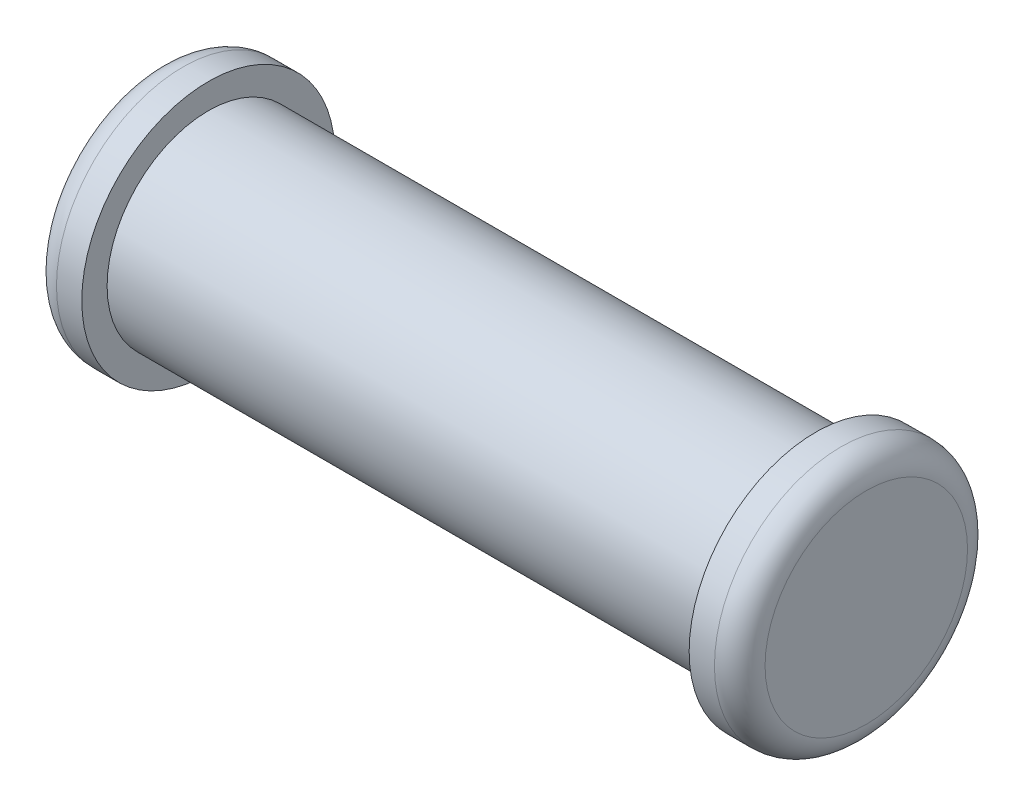
ISO-10303-21;
HEADER;
FILE_DESCRIPTION(('STEP AP214'),'2;1');
FILE_NAME('part.step','',(''),(''),'','','');
FILE_SCHEMA(('AUTOMOTIVE_DESIGN { 1 0 10303 214 1 1 1 1 }'));
ENDSEC;
DATA;
#1=APPLICATION_CONTEXT('core data for automotive mechanical design processes');
#2=APPLICATION_PROTOCOL_DEFINITION('international standard','automotive_design',2000,#1);
#3=PRODUCT_CONTEXT('',#1,'mechanical');
#4=PRODUCT('Part','Part','',(#3));
#5=PRODUCT_RELATED_PRODUCT_CATEGORY('part','',(#4));
#6=PRODUCT_DEFINITION_FORMATION('','',#4);
#7=PRODUCT_DEFINITION_CONTEXT('part definition',#1,'design');
#8=PRODUCT_DEFINITION('design','',#6,#7);
#9=PRODUCT_DEFINITION_SHAPE('','',#8);
#10=(LENGTH_UNIT() NAMED_UNIT(*) SI_UNIT(.MILLI.,.METRE.));
#11=(NAMED_UNIT(*) PLANE_ANGLE_UNIT() SI_UNIT($,.RADIAN.));
#12=(NAMED_UNIT(*) SI_UNIT($,.STERADIAN.) SOLID_ANGLE_UNIT());
#13=UNCERTAINTY_MEASURE_WITH_UNIT(LENGTH_MEASURE(1.E-05),#10,'distance_accuracy_value','');
#14=(GEOMETRIC_REPRESENTATION_CONTEXT(3) GLOBAL_UNCERTAINTY_ASSIGNED_CONTEXT((#13)) GLOBAL_UNIT_ASSIGNED_CONTEXT((#10,
#11,#12)) REPRESENTATION_CONTEXT('',''));
#15=CARTESIAN_POINT('',(0.,0.,0.));
#16=DIRECTION('',(0.,0.,1.));
#17=DIRECTION('',(1.,0.,0.));
#18=AXIS2_PLACEMENT_3D('',#15,#16,#17);
#19=CARTESIAN_POINT('',(12.,0.,0.));
#20=DIRECTION('',(-1.,0.,0.));
#21=DIRECTION('',(0.,0.,1.));
#22=AXIS2_PLACEMENT_3D('',#19,#20,#21);
#23=CYLINDRICAL_SURFACE('',#22,2.);
#24=CARTESIAN_POINT('',(12.,0.,0.));
#25=DIRECTION('',(1.,0.,0.));
#26=DIRECTION('',(0.,0.,-1.));
#27=AXIS2_PLACEMENT_3D('',#24,#25,#26);
#28=CIRCLE('',#27,2.);
#29=CARTESIAN_POINT('',(12.,0.,-2.));
#30=VERTEX_POINT('',#29);
#31=EDGE_CURVE('E69',#30,#30,#28,.T.);
#32=ORIENTED_EDGE('',*,*,#31,.F.);
#33=EDGE_LOOP('',(#32));
#34=FACE_BOUND('',#33,.T.);
#35=CARTESIAN_POINT('',(0.,0.,0.));
#36=DIRECTION('',(1.,0.,0.));
#37=DIRECTION('',(0.,0.,-1.));
#38=AXIS2_PLACEMENT_3D('',#35,#36,#37);
#39=CIRCLE('',#38,2.);
#40=CARTESIAN_POINT('',(0.,0.,-2.));
#41=VERTEX_POINT('',#40);
#42=EDGE_CURVE('E70',#41,#41,#39,.T.);
#43=ORIENTED_EDGE('',*,*,#42,.T.);
#44=EDGE_LOOP('',(#43));
#45=FACE_BOUND('',#44,.T.);
#46=ADVANCED_FACE('F45',(#34,#45),#23,.T.);
#47=CARTESIAN_POINT('',(-1.,0.,0.));
#48=DIRECTION('',(1.,0.,0.));
#49=DIRECTION('',(0.,0.,-1.));
#50=AXIS2_PLACEMENT_3D('',#47,#48,#49);
#51=CYLINDRICAL_SURFACE('',#50,2.5);
#52=CARTESIAN_POINT('',(-0.5,0.,0.));
#53=DIRECTION('',(-1.,0.,0.));
#54=DIRECTION('',(0.,0.,1.));
#55=AXIS2_PLACEMENT_3D('',#52,#53,#54);
#56=CIRCLE('',#55,2.5);
#57=CARTESIAN_POINT('',(-0.5,0.,2.5));
#58=VERTEX_POINT('',#57);
#59=EDGE_CURVE('E58',#58,#58,#56,.F.);
#60=ORIENTED_EDGE('',*,*,#59,.T.);
#61=EDGE_LOOP('',(#60));
#62=FACE_BOUND('',#61,.T.);
#63=CARTESIAN_POINT('',(0.,0.,0.));
#64=DIRECTION('',(-1.,0.,0.));
#65=DIRECTION('',(0.,0.,1.));
#66=AXIS2_PLACEMENT_3D('',#63,#64,#65);
#67=CIRCLE('',#66,2.5);
#68=CARTESIAN_POINT('',(0.,0.,2.5));
#69=VERTEX_POINT('',#68);
#70=EDGE_CURVE('E74',#69,#69,#67,.T.);
#71=ORIENTED_EDGE('',*,*,#70,.T.);
#72=EDGE_LOOP('',(#71));
#73=FACE_BOUND('',#72,.T.);
#74=ADVANCED_FACE('F103',(#62,#73),#51,.T.);
#75=CARTESIAN_POINT('',(-1.,0.,0.));
#76=DIRECTION('',(-1.,0.,0.));
#77=DIRECTION('',(0.,0.,1.));
#78=AXIS2_PLACEMENT_3D('',#75,#76,#77);
#79=PLANE('',#78);
#80=CARTESIAN_POINT('',(-1.,0.,0.));
#81=DIRECTION('',(-1.,0.,0.));
#82=DIRECTION('',(0.,0.,1.));
#83=AXIS2_PLACEMENT_3D('',#80,#81,#82);
#84=CIRCLE('',#83,2.);
#85=CARTESIAN_POINT('',(-1.,0.,2.));
#86=VERTEX_POINT('',#85);
#87=EDGE_CURVE('E63',#86,#86,#84,.T.);
#88=ORIENTED_EDGE('',*,*,#87,.T.);
#89=EDGE_LOOP('',(#88));
#90=FACE_BOUND('',#89,.T.);
#91=ADVANCED_FACE('F110',(#90),#79,.T.);
#92=CARTESIAN_POINT('',(0.,0.,0.));
#93=DIRECTION('',(-1.,0.,0.));
#94=DIRECTION('',(0.,0.,1.));
#95=AXIS2_PLACEMENT_3D('',#92,#93,#94);
#96=PLANE('',#95);
#97=ORIENTED_EDGE('',*,*,#42,.F.);
#98=EDGE_LOOP('',(#97));
#99=FACE_BOUND('',#98,.T.);
#100=ORIENTED_EDGE('',*,*,#70,.F.);
#101=EDGE_LOOP('',(#100));
#102=FACE_BOUND('',#101,.T.);
#103=ADVANCED_FACE('F98',(#99,#102),#96,.F.);
#104=CARTESIAN_POINT('',(-0.5,0.,0.));
#105=DIRECTION('',(-1.,0.,0.));
#106=DIRECTION('',(0.,0.,1.));
#107=AXIS2_PLACEMENT_3D('',#104,#105,#106);
#108=TOROIDAL_SURFACE('',#107,2.,0.5);
#109=ORIENTED_EDGE('',*,*,#59,.F.);
#110=EDGE_LOOP('',(#109));
#111=FACE_BOUND('',#110,.T.);
#112=ORIENTED_EDGE('',*,*,#87,.F.);
#113=EDGE_LOOP('',(#112));
#114=FACE_BOUND('',#113,.T.);
#115=ADVANCED_FACE('F91',(#111,#114),#108,.T.);
#116=CARTESIAN_POINT('',(13.,0.,0.));
#117=DIRECTION('',(-1.,0.,0.));
#118=DIRECTION('',(0.,0.,1.));
#119=AXIS2_PLACEMENT_3D('',#116,#117,#118);
#120=CYLINDRICAL_SURFACE('',#119,2.5);
#121=CARTESIAN_POINT('',(12.5,0.,0.));
#122=DIRECTION('',(1.,0.,0.));
#123=DIRECTION('',(0.,0.,-1.));
#124=AXIS2_PLACEMENT_3D('',#121,#122,#123);
#125=CIRCLE('',#124,2.5);
#126=CARTESIAN_POINT('',(12.5,0.,-2.5));
#127=VERTEX_POINT('',#126);
#128=EDGE_CURVE('E53',#127,#127,#125,.F.);
#129=ORIENTED_EDGE('',*,*,#128,.T.);
#130=EDGE_LOOP('',(#129));
#131=FACE_BOUND('',#130,.T.);
#132=CARTESIAN_POINT('',(12.,0.,0.));
#133=DIRECTION('',(-1.,0.,0.));
#134=DIRECTION('',(0.,0.,1.));
#135=AXIS2_PLACEMENT_3D('',#132,#133,#134);
#136=CIRCLE('',#135,2.5);
#137=CARTESIAN_POINT('',(12.,0.,2.5));
#138=VERTEX_POINT('',#137);
#139=EDGE_CURVE('E81',#138,#138,#136,.T.);
#140=ORIENTED_EDGE('',*,*,#139,.F.);
#141=EDGE_LOOP('',(#140));
#142=FACE_BOUND('',#141,.T.);
#143=ADVANCED_FACE('F88',(#131,#142),#120,.T.);
#144=CARTESIAN_POINT('',(13.,0.,0.));
#145=DIRECTION('',(1.,0.,0.));
#146=DIRECTION('',(0.,0.,1.));
#147=AXIS2_PLACEMENT_3D('',#144,#145,#146);
#148=PLANE('',#147);
#149=CARTESIAN_POINT('',(13.,0.,0.));
#150=DIRECTION('',(1.,0.,0.));
#151=DIRECTION('',(0.,0.,-1.));
#152=AXIS2_PLACEMENT_3D('',#149,#150,#151);
#153=CIRCLE('',#152,2.);
#154=CARTESIAN_POINT('',(13.,0.,-2.));
#155=VERTEX_POINT('',#154);
#156=EDGE_CURVE('E10',#155,#155,#153,.T.);
#157=ORIENTED_EDGE('',*,*,#156,.T.);
#158=EDGE_LOOP('',(#157));
#159=FACE_BOUND('',#158,.T.);
#160=ADVANCED_FACE('F90',(#159),#148,.T.);
#161=CARTESIAN_POINT('',(12.,0.,0.));
#162=DIRECTION('',(1.,0.,0.));
#163=DIRECTION('',(0.,0.,1.));
#164=AXIS2_PLACEMENT_3D('',#161,#162,#163);
#165=PLANE('',#164);
#166=ORIENTED_EDGE('',*,*,#31,.T.);
#167=EDGE_LOOP('',(#166));
#168=FACE_BOUND('',#167,.T.);
#169=ORIENTED_EDGE('',*,*,#139,.T.);
#170=EDGE_LOOP('',(#169));
#171=FACE_BOUND('',#170,.T.);
#172=ADVANCED_FACE('F86',(#168,#171),#165,.F.);
#173=CARTESIAN_POINT('',(12.5,0.,0.));
#174=DIRECTION('',(1.,0.,0.));
#175=DIRECTION('',(0.,0.,-1.));
#176=AXIS2_PLACEMENT_3D('',#173,#174,#175);
#177=TOROIDAL_SURFACE('',#176,2.,0.5);
#178=ORIENTED_EDGE('',*,*,#156,.F.);
#179=EDGE_LOOP('',(#178));
#180=FACE_BOUND('',#179,.T.);
#181=ORIENTED_EDGE('',*,*,#128,.F.);
#182=EDGE_LOOP('',(#181));
#183=FACE_BOUND('',#182,.T.);
#184=ADVANCED_FACE('F47',(#180,#183),#177,.T.);
#185=CLOSED_SHELL('',(#46,#74,#91,#103,#115,#143,#160,#172,#184));
#186=MANIFOLD_SOLID_BREP('B2',#185);
#187=ADVANCED_BREP_SHAPE_REPRESENTATION('',(#18,#186),#14);
#188=SHAPE_DEFINITION_REPRESENTATION(#9,#187);
ENDSEC;
END-ISO-10303-21;
